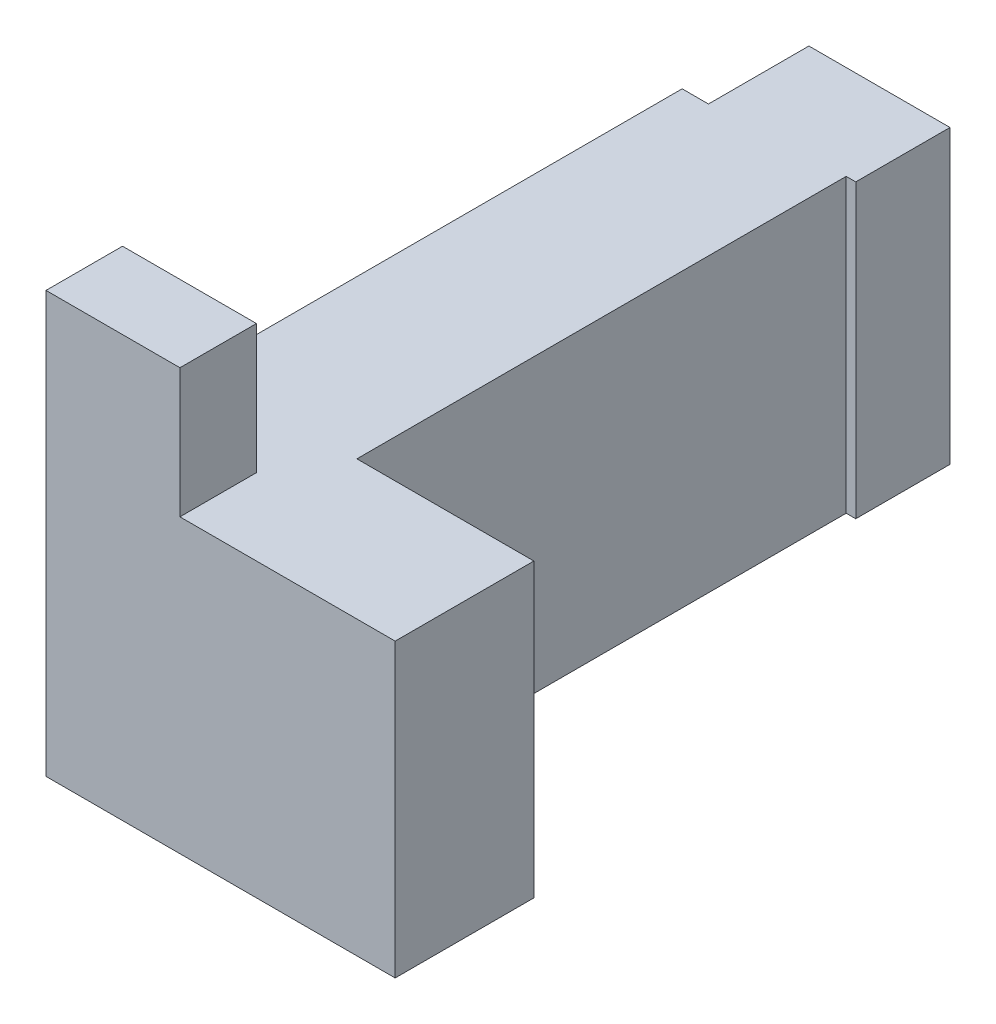
ISO-10303-21;
HEADER;
FILE_DESCRIPTION(('STEP AP214'),'2;1');
FILE_NAME('part.step','',(''),(''),'','','');
FILE_SCHEMA(('AUTOMOTIVE_DESIGN { 1 0 10303 214 1 1 1 1 }'));
ENDSEC;
DATA;
#1=APPLICATION_CONTEXT('core data for automotive mechanical design processes');
#2=APPLICATION_PROTOCOL_DEFINITION('international standard','automotive_design',2000,#1);
#3=PRODUCT_CONTEXT('',#1,'mechanical');
#4=PRODUCT('Part','Part','',(#3));
#5=PRODUCT_RELATED_PRODUCT_CATEGORY('part','',(#4));
#6=PRODUCT_DEFINITION_FORMATION('','',#4);
#7=PRODUCT_DEFINITION_CONTEXT('part definition',#1,'design');
#8=PRODUCT_DEFINITION('design','',#6,#7);
#9=PRODUCT_DEFINITION_SHAPE('','',#8);
#10=(LENGTH_UNIT() NAMED_UNIT(*) SI_UNIT(.MILLI.,.METRE.));
#11=(NAMED_UNIT(*) PLANE_ANGLE_UNIT() SI_UNIT($,.RADIAN.));
#12=(NAMED_UNIT(*) SI_UNIT($,.STERADIAN.) SOLID_ANGLE_UNIT());
#13=UNCERTAINTY_MEASURE_WITH_UNIT(LENGTH_MEASURE(1.E-05),#10,'distance_accuracy_value','');
#14=(GEOMETRIC_REPRESENTATION_CONTEXT(3) GLOBAL_UNCERTAINTY_ASSIGNED_CONTEXT((#13)) GLOBAL_UNIT_ASSIGNED_CONTEXT((#10,
#11,#12)) REPRESENTATION_CONTEXT('',''));
#15=CARTESIAN_POINT('',(0.,0.,0.));
#16=DIRECTION('',(0.,0.,1.));
#17=DIRECTION('',(1.,0.,0.));
#18=AXIS2_PLACEMENT_3D('',#15,#16,#17);
#19=CARTESIAN_POINT('',(730.,610.,0.));
#20=DIRECTION('',(0.,0.,-1.));
#21=DIRECTION('',(-1.,0.,0.));
#22=AXIS2_PLACEMENT_3D('',#19,#20,#21);
#23=PLANE('',#22);
#24=DIRECTION('',(1.,0.,0.));
#25=VECTOR('',#24,1.);
#26=CARTESIAN_POINT('',(730.,0.,0.));
#27=LINE('',#26,#25);
#28=CARTESIAN_POINT('',(0.,0.,0.));
#29=VERTEX_POINT('',#28);
#30=CARTESIAN_POINT('',(730.,0.,0.));
#31=VERTEX_POINT('',#30);
#32=EDGE_CURVE('E178',#29,#31,#27,.T.);
#33=ORIENTED_EDGE('',*,*,#32,.T.);
#34=DIRECTION('',(0.,-1.,0.));
#35=VECTOR('',#34,1.);
#36=CARTESIAN_POINT('',(730.,610.,0.));
#37=LINE('',#36,#35);
#38=CARTESIAN_POINT('',(730.,610.,0.));
#39=VERTEX_POINT('',#38);
#40=EDGE_CURVE('E11',#39,#31,#37,.T.);
#41=ORIENTED_EDGE('',*,*,#40,.F.);
#42=DIRECTION('',(1.,0.,0.));
#43=VECTOR('',#42,1.);
#44=CARTESIAN_POINT('',(730.,610.,0.));
#45=LINE('',#44,#43);
#46=CARTESIAN_POINT('',(280.,610.,0.));
#47=VERTEX_POINT('',#46);
#48=EDGE_CURVE('E176',#47,#39,#45,.T.);
#49=ORIENTED_EDGE('',*,*,#48,.F.);
#50=DIRECTION('',(0.,-1.,0.));
#51=VECTOR('',#50,1.);
#52=CARTESIAN_POINT('',(280.,880.,0.));
#53=LINE('',#52,#51);
#54=CARTESIAN_POINT('',(280.,880.,0.));
#55=VERTEX_POINT('',#54);
#56=EDGE_CURVE('E155',#55,#47,#53,.T.);
#57=ORIENTED_EDGE('',*,*,#56,.F.);
#58=DIRECTION('',(1.,0.,0.));
#59=VECTOR('',#58,1.);
#60=CARTESIAN_POINT('',(280.,880.,0.));
#61=LINE('',#60,#59);
#62=CARTESIAN_POINT('',(0.,880.,0.));
#63=VERTEX_POINT('',#62);
#64=EDGE_CURVE('E162',#63,#55,#61,.T.);
#65=ORIENTED_EDGE('',*,*,#64,.F.);
#66=DIRECTION('',(0.,-1.,0.));
#67=VECTOR('',#66,1.);
#68=CARTESIAN_POINT('',(0.,610.,0.));
#69=LINE('',#68,#67);
#70=EDGE_CURVE('E222',#63,#29,#69,.T.);
#71=ORIENTED_EDGE('',*,*,#70,.T.);
#72=EDGE_LOOP('',(#33,#41,#49,#57,#65,#71));
#73=FACE_BOUND('',#72,.T.);
#74=ADVANCED_FACE('F45',(#73),#23,.F.);
#75=CARTESIAN_POINT('',(730.,610.,-290.));
#76=DIRECTION('',(-1.,0.,0.));
#77=DIRECTION('',(0.,0.,1.));
#78=AXIS2_PLACEMENT_3D('',#75,#76,#77);
#79=PLANE('',#78);
#80=DIRECTION('',(0.,0.,-1.));
#81=VECTOR('',#80,1.);
#82=CARTESIAN_POINT('',(730.,0.,-290.));
#83=LINE('',#82,#81);
#84=CARTESIAN_POINT('',(730.,0.,-290.));
#85=VERTEX_POINT('',#84);
#86=EDGE_CURVE('E182',#31,#85,#83,.T.);
#87=ORIENTED_EDGE('',*,*,#86,.T.);
#88=DIRECTION('',(0.,-1.,0.));
#89=VECTOR('',#88,1.);
#90=CARTESIAN_POINT('',(730.,610.,-290.));
#91=LINE('',#90,#89);
#92=CARTESIAN_POINT('',(730.,610.,-290.));
#93=VERTEX_POINT('',#92);
#94=EDGE_CURVE('E53',#93,#85,#91,.T.);
#95=ORIENTED_EDGE('',*,*,#94,.F.);
#96=DIRECTION('',(0.,0.,-1.));
#97=VECTOR('',#96,1.);
#98=CARTESIAN_POINT('',(730.,610.,-290.));
#99=LINE('',#98,#97);
#100=EDGE_CURVE('E190',#39,#93,#99,.T.);
#101=ORIENTED_EDGE('',*,*,#100,.F.);
#102=ORIENTED_EDGE('',*,*,#40,.T.);
#103=EDGE_LOOP('',(#87,#95,#101,#102));
#104=FACE_BOUND('',#103,.T.);
#105=ADVANCED_FACE('F319',(#104),#79,.F.);
#106=CARTESIAN_POINT('',(730.,610.,-290.));
#107=DIRECTION('',(0.,0.,1.));
#108=DIRECTION('',(1.,0.,0.));
#109=AXIS2_PLACEMENT_3D('',#106,#107,#108);
#110=PLANE('',#109);
#111=DIRECTION('',(-1.,0.,0.));
#112=VECTOR('',#111,1.);
#113=CARTESIAN_POINT('',(730.,0.,-290.));
#114=LINE('',#113,#112);
#115=CARTESIAN_POINT('',(360.,0.,-290.));
#116=VERTEX_POINT('',#115);
#117=EDGE_CURVE('E226',#85,#116,#114,.T.);
#118=ORIENTED_EDGE('',*,*,#117,.T.);
#119=DIRECTION('',(0.,-1.,0.));
#120=VECTOR('',#119,1.);
#121=CARTESIAN_POINT('',(360.,610.,-290.));
#122=LINE('',#121,#120);
#123=CARTESIAN_POINT('',(360.,610.,-290.));
#124=VERTEX_POINT('',#123);
#125=EDGE_CURVE('E289',#124,#116,#122,.T.);
#126=ORIENTED_EDGE('',*,*,#125,.F.);
#127=DIRECTION('',(-1.,0.,0.));
#128=VECTOR('',#127,1.);
#129=CARTESIAN_POINT('',(730.,610.,-290.));
#130=LINE('',#129,#128);
#131=EDGE_CURVE('E194',#93,#124,#130,.T.);
#132=ORIENTED_EDGE('',*,*,#131,.F.);
#133=ORIENTED_EDGE('',*,*,#94,.T.);
#134=EDGE_LOOP('',(#118,#126,#132,#133));
#135=FACE_BOUND('',#134,.T.);
#136=ADVANCED_FACE('F298',(#135),#110,.F.);
#137=CARTESIAN_POINT('',(360.,610.,-290.));
#138=DIRECTION('',(-1.,0.,0.));
#139=DIRECTION('',(0.,0.,1.));
#140=AXIS2_PLACEMENT_3D('',#137,#138,#139);
#141=PLANE('',#140);
#142=DIRECTION('',(0.,0.,-1.));
#143=VECTOR('',#142,1.);
#144=CARTESIAN_POINT('',(360.,0.,-290.));
#145=LINE('',#144,#143);
#146=CARTESIAN_POINT('',(360.,0.,-1312.95763872185));
#147=VERTEX_POINT('',#146);
#148=EDGE_CURVE('E229',#116,#147,#145,.T.);
#149=ORIENTED_EDGE('',*,*,#148,.T.);
#150=DIRECTION('',(0.,-1.,0.));
#151=VECTOR('',#150,1.);
#152=CARTESIAN_POINT('',(360.,610.,-1312.95763872185));
#153=LINE('',#152,#151);
#154=CARTESIAN_POINT('',(360.,610.,-1312.95763872185));
#155=VERTEX_POINT('',#154);
#156=EDGE_CURVE('E285',#155,#147,#153,.T.);
#157=ORIENTED_EDGE('',*,*,#156,.F.);
#158=DIRECTION('',(0.,0.,-1.));
#159=VECTOR('',#158,1.);
#160=CARTESIAN_POINT('',(360.,610.,-290.));
#161=LINE('',#160,#159);
#162=EDGE_CURVE('E197',#124,#155,#161,.T.);
#163=ORIENTED_EDGE('',*,*,#162,.F.);
#164=ORIENTED_EDGE('',*,*,#125,.T.);
#165=EDGE_LOOP('',(#149,#157,#163,#164));
#166=FACE_BOUND('',#165,.T.);
#167=ADVANCED_FACE('F310',(#166),#141,.F.);
#168=CARTESIAN_POINT('',(360.,610.,-1312.95763872185));
#169=DIRECTION('',(0.,0.,-1.));
#170=DIRECTION('',(-1.,0.,0.));
#171=AXIS2_PLACEMENT_3D('',#168,#169,#170);
#172=PLANE('',#171);
#173=DIRECTION('',(1.,0.,0.));
#174=VECTOR('',#173,1.);
#175=CARTESIAN_POINT('',(360.,0.,-1312.95763872185));
#176=LINE('',#175,#174);
#177=CARTESIAN_POINT('',(380.,0.,-1312.95763872185));
#178=VERTEX_POINT('',#177);
#179=EDGE_CURVE('E232',#147,#178,#176,.T.);
#180=ORIENTED_EDGE('',*,*,#179,.T.);
#181=DIRECTION('',(0.,-1.,0.));
#182=VECTOR('',#181,1.);
#183=CARTESIAN_POINT('',(380.,610.,-1312.95763872185));
#184=LINE('',#183,#182);
#185=CARTESIAN_POINT('',(380.,610.,-1312.95763872185));
#186=VERTEX_POINT('',#185);
#187=EDGE_CURVE('E281',#186,#178,#184,.T.);
#188=ORIENTED_EDGE('',*,*,#187,.F.);
#189=DIRECTION('',(1.,0.,0.));
#190=VECTOR('',#189,1.);
#191=CARTESIAN_POINT('',(360.,610.,-1312.95763872185));
#192=LINE('',#191,#190);
#193=EDGE_CURVE('E200',#155,#186,#192,.T.);
#194=ORIENTED_EDGE('',*,*,#193,.F.);
#195=ORIENTED_EDGE('',*,*,#156,.T.);
#196=EDGE_LOOP('',(#180,#188,#194,#195));
#197=FACE_BOUND('',#196,.T.);
#198=ADVANCED_FACE('F314',(#197),#172,.F.);
#199=CARTESIAN_POINT('',(380.,610.,-1312.95763872185));
#200=DIRECTION('',(-1.,0.,0.));
#201=DIRECTION('',(0.,0.,1.));
#202=AXIS2_PLACEMENT_3D('',#199,#200,#201);
#203=PLANE('',#202);
#204=DIRECTION('',(0.,0.,-1.));
#205=VECTOR('',#204,1.);
#206=CARTESIAN_POINT('',(380.,0.,-1312.95763872185));
#207=LINE('',#206,#205);
#208=CARTESIAN_POINT('',(380.,0.,-1510.));
#209=VERTEX_POINT('',#208);
#210=EDGE_CURVE('E235',#178,#209,#207,.T.);
#211=ORIENTED_EDGE('',*,*,#210,.T.);
#212=DIRECTION('',(0.,-1.,0.));
#213=VECTOR('',#212,1.);
#214=CARTESIAN_POINT('',(380.,610.,-1510.));
#215=LINE('',#214,#213);
#216=CARTESIAN_POINT('',(380.,610.,-1510.));
#217=VERTEX_POINT('',#216);
#218=EDGE_CURVE('E277',#217,#209,#215,.T.);
#219=ORIENTED_EDGE('',*,*,#218,.F.);
#220=DIRECTION('',(0.,0.,-1.));
#221=VECTOR('',#220,1.);
#222=CARTESIAN_POINT('',(380.,610.,-1312.95763872185));
#223=LINE('',#222,#221);
#224=EDGE_CURVE('E203',#186,#217,#223,.T.);
#225=ORIENTED_EDGE('',*,*,#224,.F.);
#226=ORIENTED_EDGE('',*,*,#187,.T.);
#227=EDGE_LOOP('',(#211,#219,#225,#226));
#228=FACE_BOUND('',#227,.T.);
#229=ADVANCED_FACE('F350',(#228),#203,.F.);
#230=CARTESIAN_POINT('',(380.,610.,-1510.));
#231=DIRECTION('',(0.,0.,1.));
#232=DIRECTION('',(1.,0.,0.));
#233=AXIS2_PLACEMENT_3D('',#230,#231,#232);
#234=PLANE('',#233);
#235=DIRECTION('',(-1.,0.,0.));
#236=VECTOR('',#235,1.);
#237=CARTESIAN_POINT('',(380.,0.,-1510.));
#238=LINE('',#237,#236);
#239=CARTESIAN_POINT('',(85.0000000000001,0.,-1510.));
#240=VERTEX_POINT('',#239);
#241=EDGE_CURVE('E238',#209,#240,#238,.T.);
#242=ORIENTED_EDGE('',*,*,#241,.T.);
#243=DIRECTION('',(0.,-1.,0.));
#244=VECTOR('',#243,1.);
#245=CARTESIAN_POINT('',(85.0000000000001,610.,-1510.));
#246=LINE('',#245,#244);
#247=CARTESIAN_POINT('',(85.0000000000001,610.,-1510.));
#248=VERTEX_POINT('',#247);
#249=EDGE_CURVE('E273',#248,#240,#246,.T.);
#250=ORIENTED_EDGE('',*,*,#249,.F.);
#251=DIRECTION('',(-1.,0.,0.));
#252=VECTOR('',#251,1.);
#253=CARTESIAN_POINT('',(380.,610.,-1510.));
#254=LINE('',#253,#252);
#255=EDGE_CURVE('E206',#217,#248,#254,.T.);
#256=ORIENTED_EDGE('',*,*,#255,.F.);
#257=ORIENTED_EDGE('',*,*,#218,.T.);
#258=EDGE_LOOP('',(#242,#250,#256,#257));
#259=FACE_BOUND('',#258,.T.);
#260=ADVANCED_FACE('F348',(#259),#234,.F.);
#261=CARTESIAN_POINT('',(85.0000000000001,610.,-1510.));
#262=DIRECTION('',(1.,0.,0.));
#263=DIRECTION('',(0.,0.,-1.));
#264=AXIS2_PLACEMENT_3D('',#261,#262,#263);
#265=PLANE('',#264);
#266=DIRECTION('',(0.,0.,1.));
#267=VECTOR('',#266,1.);
#268=CARTESIAN_POINT('',(85.0000000000001,0.,-1510.));
#269=LINE('',#268,#267);
#270=CARTESIAN_POINT('',(85.0000000000001,0.,-1300.));
#271=VERTEX_POINT('',#270);
#272=EDGE_CURVE('E241',#240,#271,#269,.T.);
#273=ORIENTED_EDGE('',*,*,#272,.T.);
#274=DIRECTION('',(0.,-1.,0.));
#275=VECTOR('',#274,1.);
#276=CARTESIAN_POINT('',(85.0000000000001,610.,-1300.));
#277=LINE('',#276,#275);
#278=CARTESIAN_POINT('',(85.0000000000001,610.,-1300.));
#279=VERTEX_POINT('',#278);
#280=EDGE_CURVE('E269',#279,#271,#277,.T.);
#281=ORIENTED_EDGE('',*,*,#280,.F.);
#282=DIRECTION('',(0.,0.,1.));
#283=VECTOR('',#282,1.);
#284=CARTESIAN_POINT('',(85.0000000000001,610.,-1510.));
#285=LINE('',#284,#283);
#286=EDGE_CURVE('E209',#248,#279,#285,.T.);
#287=ORIENTED_EDGE('',*,*,#286,.F.);
#288=ORIENTED_EDGE('',*,*,#249,.T.);
#289=EDGE_LOOP('',(#273,#281,#287,#288));
#290=FACE_BOUND('',#289,.T.);
#291=ADVANCED_FACE('F344',(#290),#265,.F.);
#292=CARTESIAN_POINT('',(85.0000000000001,610.,-1300.));
#293=DIRECTION('',(0.,0.,1.));
#294=DIRECTION('',(1.,0.,0.));
#295=AXIS2_PLACEMENT_3D('',#292,#293,#294);
#296=PLANE('',#295);
#297=DIRECTION('',(-1.,0.,0.));
#298=VECTOR('',#297,1.);
#299=CARTESIAN_POINT('',(85.0000000000001,0.,-1300.));
#300=LINE('',#299,#298);
#301=CARTESIAN_POINT('',(29.9999999999998,0.,-1300.));
#302=VERTEX_POINT('',#301);
#303=EDGE_CURVE('E244',#271,#302,#300,.T.);
#304=ORIENTED_EDGE('',*,*,#303,.T.);
#305=DIRECTION('',(0.,-1.,0.));
#306=VECTOR('',#305,1.);
#307=CARTESIAN_POINT('',(29.9999999999998,610.,-1300.));
#308=LINE('',#307,#306);
#309=CARTESIAN_POINT('',(29.9999999999998,610.,-1300.));
#310=VERTEX_POINT('',#309);
#311=EDGE_CURVE('E265',#310,#302,#308,.T.);
#312=ORIENTED_EDGE('',*,*,#311,.F.);
#313=DIRECTION('',(-1.,0.,0.));
#314=VECTOR('',#313,1.);
#315=CARTESIAN_POINT('',(85.0000000000001,610.,-1300.));
#316=LINE('',#315,#314);
#317=EDGE_CURVE('E212',#279,#310,#316,.T.);
#318=ORIENTED_EDGE('',*,*,#317,.F.);
#319=ORIENTED_EDGE('',*,*,#280,.T.);
#320=EDGE_LOOP('',(#304,#312,#318,#319));
#321=FACE_BOUND('',#320,.T.);
#322=ADVANCED_FACE('F339',(#321),#296,.F.);
#323=CARTESIAN_POINT('',(29.9999999999998,610.,-1300.));
#324=DIRECTION('',(1.,0.,0.));
#325=DIRECTION('',(0.,0.,-1.));
#326=AXIS2_PLACEMENT_3D('',#323,#324,#325);
#327=PLANE('',#326);
#328=DIRECTION('',(0.,0.,1.));
#329=VECTOR('',#328,1.);
#330=CARTESIAN_POINT('',(29.9999999999998,0.,-1300.));
#331=LINE('',#330,#329);
#332=CARTESIAN_POINT('',(30.,0.,-320.));
#333=VERTEX_POINT('',#332);
#334=EDGE_CURVE('E247',#302,#333,#331,.T.);
#335=ORIENTED_EDGE('',*,*,#334,.T.);
#336=DIRECTION('',(0.,-1.,0.));
#337=VECTOR('',#336,1.);
#338=CARTESIAN_POINT('',(30.,610.,-320.));
#339=LINE('',#338,#337);
#340=CARTESIAN_POINT('',(30.,610.,-320.));
#341=VERTEX_POINT('',#340);
#342=EDGE_CURVE('E261',#341,#333,#339,.T.);
#343=ORIENTED_EDGE('',*,*,#342,.F.);
#344=DIRECTION('',(0.,0.,1.));
#345=VECTOR('',#344,1.);
#346=CARTESIAN_POINT('',(29.9999999999998,610.,-1300.));
#347=LINE('',#346,#345);
#348=EDGE_CURVE('E215',#310,#341,#347,.T.);
#349=ORIENTED_EDGE('',*,*,#348,.F.);
#350=ORIENTED_EDGE('',*,*,#311,.T.);
#351=EDGE_LOOP('',(#335,#343,#349,#350));
#352=FACE_BOUND('',#351,.T.);
#353=ADVANCED_FACE('F333',(#352),#327,.F.);
#354=CARTESIAN_POINT('',(30.,610.,-320.));
#355=DIRECTION('',(0.,0.,1.));
#356=DIRECTION('',(1.,0.,0.));
#357=AXIS2_PLACEMENT_3D('',#354,#355,#356);
#358=PLANE('',#357);
#359=DIRECTION('',(-1.,0.,0.));
#360=VECTOR('',#359,1.);
#361=CARTESIAN_POINT('',(30.,0.,-320.));
#362=LINE('',#361,#360);
#363=CARTESIAN_POINT('',(0.,0.,-320.));
#364=VERTEX_POINT('',#363);
#365=EDGE_CURVE('E250',#333,#364,#362,.T.);
#366=ORIENTED_EDGE('',*,*,#365,.T.);
#367=DIRECTION('',(0.,-1.,0.));
#368=VECTOR('',#367,1.);
#369=CARTESIAN_POINT('',(0.,610.,-320.));
#370=LINE('',#369,#368);
#371=CARTESIAN_POINT('',(0.,610.,-320.));
#372=VERTEX_POINT('',#371);
#373=EDGE_CURVE('E257',#372,#364,#370,.T.);
#374=ORIENTED_EDGE('',*,*,#373,.F.);
#375=DIRECTION('',(-1.,0.,0.));
#376=VECTOR('',#375,1.);
#377=CARTESIAN_POINT('',(30.,610.,-320.));
#378=LINE('',#377,#376);
#379=EDGE_CURVE('E218',#341,#372,#378,.T.);
#380=ORIENTED_EDGE('',*,*,#379,.F.);
#381=ORIENTED_EDGE('',*,*,#342,.T.);
#382=EDGE_LOOP('',(#366,#374,#380,#381));
#383=FACE_BOUND('',#382,.T.);
#384=ADVANCED_FACE('F329',(#383),#358,.F.);
#385=CARTESIAN_POINT('',(0.,610.,-320.));
#386=DIRECTION('',(1.,0.,0.));
#387=DIRECTION('',(0.,0.,-1.));
#388=AXIS2_PLACEMENT_3D('',#385,#386,#387);
#389=PLANE('',#388);
#390=DIRECTION('',(0.,0.,1.));
#391=VECTOR('',#390,1.);
#392=CARTESIAN_POINT('',(0.,0.,-320.));
#393=LINE('',#392,#391);
#394=EDGE_CURVE('E191',#364,#29,#393,.T.);
#395=ORIENTED_EDGE('',*,*,#394,.T.);
#396=ORIENTED_EDGE('',*,*,#70,.F.);
#397=DIRECTION('',(0.,0.,1.));
#398=VECTOR('',#397,1.);
#399=CARTESIAN_POINT('',(0.,880.,0.));
#400=LINE('',#399,#398);
#401=CARTESIAN_POINT('',(0.,880.,-160.));
#402=VERTEX_POINT('',#401);
#403=EDGE_CURVE('E168',#402,#63,#400,.T.);
#404=ORIENTED_EDGE('',*,*,#403,.F.);
#405=DIRECTION('',(0.,-1.,0.));
#406=VECTOR('',#405,1.);
#407=CARTESIAN_POINT('',(0.,880.,-160.));
#408=LINE('',#407,#406);
#409=CARTESIAN_POINT('',(0.,610.,-160.));
#410=VERTEX_POINT('',#409);
#411=EDGE_CURVE('E184',#402,#410,#408,.T.);
#412=ORIENTED_EDGE('',*,*,#411,.T.);
#413=DIRECTION('',(0.,0.,1.));
#414=VECTOR('',#413,1.);
#415=CARTESIAN_POINT('',(0.,610.,-320.));
#416=LINE('',#415,#414);
#417=EDGE_CURVE('E60',#372,#410,#416,.T.);
#418=ORIENTED_EDGE('',*,*,#417,.F.);
#419=ORIENTED_EDGE('',*,*,#373,.T.);
#420=EDGE_LOOP('',(#395,#396,#404,#412,#418,#419));
#421=FACE_BOUND('',#420,.T.);
#422=ADVANCED_FACE('F324',(#421),#389,.F.);
#423=CARTESIAN_POINT('',(0.,610.,0.));
#424=DIRECTION('',(0.,1.,0.));
#425=DIRECTION('',(0.,0.,1.));
#426=AXIS2_PLACEMENT_3D('',#423,#424,#425);
#427=PLANE('',#426);
#428=DIRECTION('',(-1.,0.,0.));
#429=VECTOR('',#428,1.);
#430=CARTESIAN_POINT('',(0.,610.,-160.));
#431=LINE('',#430,#429);
#432=CARTESIAN_POINT('',(280.,610.,-160.));
#433=VERTEX_POINT('',#432);
#434=EDGE_CURVE('E172',#433,#410,#431,.T.);
#435=ORIENTED_EDGE('',*,*,#434,.F.);
#436=DIRECTION('',(0.,0.,-1.));
#437=VECTOR('',#436,1.);
#438=CARTESIAN_POINT('',(280.,610.,-160.));
#439=LINE('',#438,#437);
#440=EDGE_CURVE('E66',#47,#433,#439,.T.);
#441=ORIENTED_EDGE('',*,*,#440,.F.);
#442=ORIENTED_EDGE('',*,*,#48,.T.);
#443=ORIENTED_EDGE('',*,*,#100,.T.);
#444=ORIENTED_EDGE('',*,*,#131,.T.);
#445=ORIENTED_EDGE('',*,*,#162,.T.);
#446=ORIENTED_EDGE('',*,*,#193,.T.);
#447=ORIENTED_EDGE('',*,*,#224,.T.);
#448=ORIENTED_EDGE('',*,*,#255,.T.);
#449=ORIENTED_EDGE('',*,*,#286,.T.);
#450=ORIENTED_EDGE('',*,*,#317,.T.);
#451=ORIENTED_EDGE('',*,*,#348,.T.);
#452=ORIENTED_EDGE('',*,*,#379,.T.);
#453=ORIENTED_EDGE('',*,*,#417,.T.);
#454=EDGE_LOOP('',(#435,#441,#442,#443,#444,#445,#446,#447,#448,#449,#450,#451,#452,#453));
#455=FACE_BOUND('',#454,.T.);
#456=ADVANCED_FACE('F317',(#455),#427,.T.);
#457=CARTESIAN_POINT('',(0.,0.,0.));
#458=DIRECTION('',(0.,1.,0.));
#459=DIRECTION('',(0.,0.,1.));
#460=AXIS2_PLACEMENT_3D('',#457,#458,#459);
#461=PLANE('',#460);
#462=ORIENTED_EDGE('',*,*,#32,.F.);
#463=ORIENTED_EDGE('',*,*,#394,.F.);
#464=ORIENTED_EDGE('',*,*,#365,.F.);
#465=ORIENTED_EDGE('',*,*,#334,.F.);
#466=ORIENTED_EDGE('',*,*,#303,.F.);
#467=ORIENTED_EDGE('',*,*,#272,.F.);
#468=ORIENTED_EDGE('',*,*,#241,.F.);
#469=ORIENTED_EDGE('',*,*,#210,.F.);
#470=ORIENTED_EDGE('',*,*,#179,.F.);
#471=ORIENTED_EDGE('',*,*,#148,.F.);
#472=ORIENTED_EDGE('',*,*,#117,.F.);
#473=ORIENTED_EDGE('',*,*,#86,.F.);
#474=EDGE_LOOP('',(#462,#463,#464,#465,#466,#467,#468,#469,#470,#471,#472,#473));
#475=FACE_BOUND('',#474,.T.);
#476=ADVANCED_FACE('F305',(#475),#461,.F.);
#477=CARTESIAN_POINT('',(280.,880.,-160.));
#478=DIRECTION('',(-1.,0.,0.));
#479=DIRECTION('',(0.,0.,1.));
#480=AXIS2_PLACEMENT_3D('',#477,#478,#479);
#481=PLANE('',#480);
#482=ORIENTED_EDGE('',*,*,#440,.T.);
#483=DIRECTION('',(0.,-1.,0.));
#484=VECTOR('',#483,1.);
#485=CARTESIAN_POINT('',(280.,880.,-160.));
#486=LINE('',#485,#484);
#487=CARTESIAN_POINT('',(280.,880.,-160.));
#488=VERTEX_POINT('',#487);
#489=EDGE_CURVE('E157',#488,#433,#486,.T.);
#490=ORIENTED_EDGE('',*,*,#489,.F.);
#491=DIRECTION('',(0.,0.,-1.));
#492=VECTOR('',#491,1.);
#493=CARTESIAN_POINT('',(280.,880.,-160.));
#494=LINE('',#493,#492);
#495=EDGE_CURVE('E151',#55,#488,#494,.T.);
#496=ORIENTED_EDGE('',*,*,#495,.F.);
#497=ORIENTED_EDGE('',*,*,#56,.T.);
#498=EDGE_LOOP('',(#482,#490,#496,#497));
#499=FACE_BOUND('',#498,.T.);
#500=ADVANCED_FACE('F153',(#499),#481,.F.);
#501=CARTESIAN_POINT('',(0.,880.,-160.));
#502=DIRECTION('',(0.,0.,1.));
#503=DIRECTION('',(1.,0.,0.));
#504=AXIS2_PLACEMENT_3D('',#501,#502,#503);
#505=PLANE('',#504);
#506=ORIENTED_EDGE('',*,*,#434,.T.);
#507=ORIENTED_EDGE('',*,*,#411,.F.);
#508=DIRECTION('',(-1.,0.,0.));
#509=VECTOR('',#508,1.);
#510=CARTESIAN_POINT('',(0.,880.,-160.));
#511=LINE('',#510,#509);
#512=EDGE_CURVE('E161',#488,#402,#511,.T.);
#513=ORIENTED_EDGE('',*,*,#512,.F.);
#514=ORIENTED_EDGE('',*,*,#489,.T.);
#515=EDGE_LOOP('',(#506,#507,#513,#514));
#516=FACE_BOUND('',#515,.T.);
#517=ADVANCED_FACE('F471',(#516),#505,.F.);
#518=CARTESIAN_POINT('',(0.,880.,0.));
#519=DIRECTION('',(0.,-1.,0.));
#520=DIRECTION('',(0.,0.,-1.));
#521=AXIS2_PLACEMENT_3D('',#518,#519,#520);
#522=PLANE('',#521);
#523=ORIENTED_EDGE('',*,*,#64,.T.);
#524=ORIENTED_EDGE('',*,*,#495,.T.);
#525=ORIENTED_EDGE('',*,*,#512,.T.);
#526=ORIENTED_EDGE('',*,*,#403,.T.);
#527=EDGE_LOOP('',(#523,#524,#525,#526));
#528=FACE_BOUND('',#527,.T.);
#529=ADVANCED_FACE('F166',(#528),#522,.F.);
#530=CLOSED_SHELL('',(#74,#105,#136,#167,#198,#229,#260,#291,#322,#353,#384,#422,#456,#476,#500,
#517,#529));
#531=MANIFOLD_SOLID_BREP('B2',#530);
#532=ADVANCED_BREP_SHAPE_REPRESENTATION('',(#18,#531),#14);
#533=SHAPE_DEFINITION_REPRESENTATION(#9,#532);
ENDSEC;
END-ISO-10303-21;
